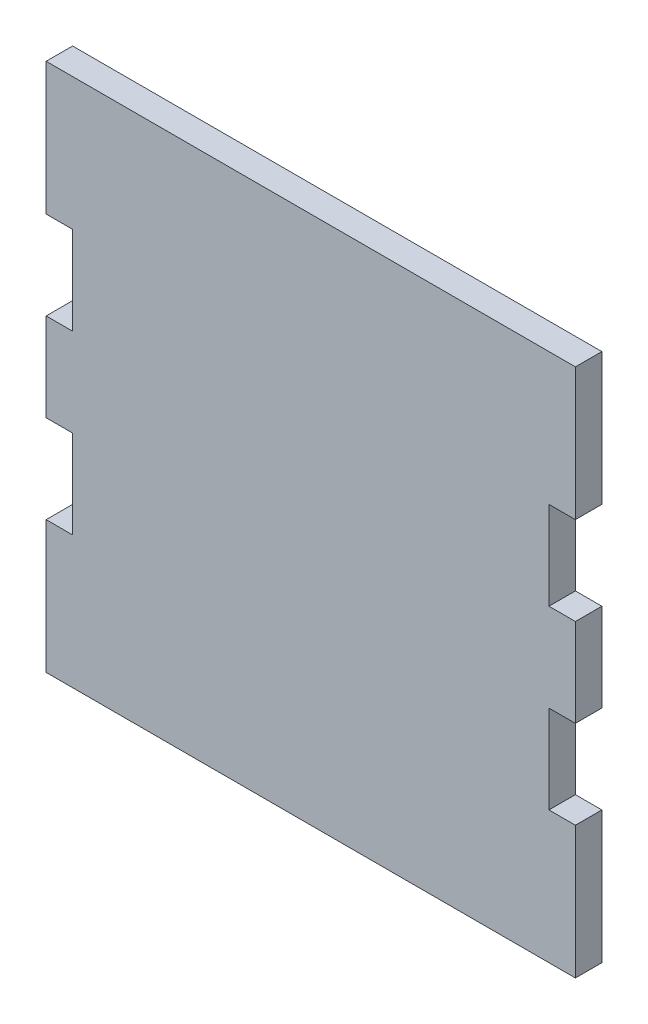
ISO-10303-21;
HEADER;
FILE_DESCRIPTION(('STEP AP214'),'2;1');
FILE_NAME('part.step','',(''),(''),'','','');
FILE_SCHEMA(('AUTOMOTIVE_DESIGN { 1 0 10303 214 1 1 1 1 }'));
ENDSEC;
DATA;
#1=APPLICATION_CONTEXT('core data for automotive mechanical design processes');
#2=APPLICATION_PROTOCOL_DEFINITION('international standard','automotive_design',2000,#1);
#3=PRODUCT_CONTEXT('',#1,'mechanical');
#4=PRODUCT('Part','Part','',(#3));
#5=PRODUCT_RELATED_PRODUCT_CATEGORY('part','',(#4));
#6=PRODUCT_DEFINITION_FORMATION('','',#4);
#7=PRODUCT_DEFINITION_CONTEXT('part definition',#1,'design');
#8=PRODUCT_DEFINITION('design','',#6,#7);
#9=PRODUCT_DEFINITION_SHAPE('','',#8);
#10=(LENGTH_UNIT() NAMED_UNIT(*) SI_UNIT(.MILLI.,.METRE.));
#11=(NAMED_UNIT(*) PLANE_ANGLE_UNIT() SI_UNIT($,.RADIAN.));
#12=(NAMED_UNIT(*) SI_UNIT($,.STERADIAN.) SOLID_ANGLE_UNIT());
#13=UNCERTAINTY_MEASURE_WITH_UNIT(LENGTH_MEASURE(1.E-05),#10,'distance_accuracy_value','');
#14=(GEOMETRIC_REPRESENTATION_CONTEXT(3) GLOBAL_UNCERTAINTY_ASSIGNED_CONTEXT((#13)) GLOBAL_UNIT_ASSIGNED_CONTEXT((#10,
#11,#12)) REPRESENTATION_CONTEXT('',''));
#15=CARTESIAN_POINT('',(0.,0.,0.));
#16=DIRECTION('',(0.,0.,1.));
#17=DIRECTION('',(1.,0.,0.));
#18=AXIS2_PLACEMENT_3D('',#15,#16,#17);
#19=CARTESIAN_POINT('',(-30.,0.,3.));
#20=DIRECTION('',(-1.,0.,0.));
#21=DIRECTION('',(0.,0.,1.));
#22=AXIS2_PLACEMENT_3D('',#19,#20,#21);
#23=PLANE('',#22);
#24=DIRECTION('',(0.,1.,0.));
#25=VECTOR('',#24,1.);
#26=CARTESIAN_POINT('',(-30.,0.,0.));
#27=LINE('',#26,#25);
#28=CARTESIAN_POINT('',(-30.,15.,0.));
#29=VERTEX_POINT('',#28);
#30=CARTESIAN_POINT('',(-30.,30.,0.));
#31=VERTEX_POINT('',#30);
#32=EDGE_CURVE('E201',#29,#31,#27,.T.);
#33=ORIENTED_EDGE('',*,*,#32,.F.);
#34=DIRECTION('',(0.,0.,-1.));
#35=VECTOR('',#34,1.);
#36=CARTESIAN_POINT('',(-30.,15.,3.));
#37=LINE('',#36,#35);
#38=CARTESIAN_POINT('',(-30.,15.,3.));
#39=VERTEX_POINT('',#38);
#40=EDGE_CURVE('E11',#39,#29,#37,.T.);
#41=ORIENTED_EDGE('',*,*,#40,.F.);
#42=DIRECTION('',(0.,1.,0.));
#43=VECTOR('',#42,1.);
#44=CARTESIAN_POINT('',(-30.,0.,3.));
#45=LINE('',#44,#43);
#46=CARTESIAN_POINT('',(-30.,30.,3.));
#47=VERTEX_POINT('',#46);
#48=EDGE_CURVE('E247',#39,#47,#45,.T.);
#49=ORIENTED_EDGE('',*,*,#48,.T.);
#50=DIRECTION('',(0.,0.,-1.));
#51=VECTOR('',#50,1.);
#52=CARTESIAN_POINT('',(-30.,30.,3.));
#53=LINE('',#52,#51);
#54=EDGE_CURVE('E52',#47,#31,#53,.T.);
#55=ORIENTED_EDGE('',*,*,#54,.T.);
#56=EDGE_LOOP('',(#33,#41,#49,#55));
#57=FACE_BOUND('',#56,.T.);
#58=ADVANCED_FACE('F35',(#57),#23,.T.);
#59=CARTESIAN_POINT('',(0.,15.,3.));
#60=DIRECTION('',(0.,1.,0.));
#61=DIRECTION('',(0.,0.,1.));
#62=AXIS2_PLACEMENT_3D('',#59,#60,#61);
#63=PLANE('',#62);
#64=DIRECTION('',(1.,0.,0.));
#65=VECTOR('',#64,1.);
#66=CARTESIAN_POINT('',(0.,15.,0.));
#67=LINE('',#66,#65);
#68=CARTESIAN_POINT('',(-27.,15.,0.));
#69=VERTEX_POINT('',#68);
#70=EDGE_CURVE('E203',#29,#69,#67,.T.);
#71=ORIENTED_EDGE('',*,*,#70,.T.);
#72=DIRECTION('',(0.,0.,-1.));
#73=VECTOR('',#72,1.);
#74=CARTESIAN_POINT('',(-27.,15.,3.));
#75=LINE('',#74,#73);
#76=CARTESIAN_POINT('',(-27.,15.,3.));
#77=VERTEX_POINT('',#76);
#78=EDGE_CURVE('E44',#77,#69,#75,.T.);
#79=ORIENTED_EDGE('',*,*,#78,.F.);
#80=DIRECTION('',(1.,0.,0.));
#81=VECTOR('',#80,1.);
#82=CARTESIAN_POINT('',(0.,15.,3.));
#83=LINE('',#82,#81);
#84=EDGE_CURVE('E310',#39,#77,#83,.T.);
#85=ORIENTED_EDGE('',*,*,#84,.F.);
#86=ORIENTED_EDGE('',*,*,#40,.T.);
#87=EDGE_LOOP('',(#71,#79,#85,#86));
#88=FACE_BOUND('',#87,.T.);
#89=ADVANCED_FACE('F37',(#88),#63,.F.);
#90=CARTESIAN_POINT('',(-27.,0.,3.));
#91=DIRECTION('',(1.,0.,0.));
#92=DIRECTION('',(0.,0.,-1.));
#93=AXIS2_PLACEMENT_3D('',#90,#91,#92);
#94=PLANE('',#93);
#95=DIRECTION('',(0.,-1.,0.));
#96=VECTOR('',#95,1.);
#97=CARTESIAN_POINT('',(-27.,0.,0.));
#98=LINE('',#97,#96);
#99=CARTESIAN_POINT('',(-27.,5.,0.));
#100=VERTEX_POINT('',#99);
#101=EDGE_CURVE('E207',#69,#100,#98,.T.);
#102=ORIENTED_EDGE('',*,*,#101,.T.);
#103=DIRECTION('',(0.,0.,-1.));
#104=VECTOR('',#103,1.);
#105=CARTESIAN_POINT('',(-27.,5.,3.));
#106=LINE('',#105,#104);
#107=CARTESIAN_POINT('',(-27.,5.,3.));
#108=VERTEX_POINT('',#107);
#109=EDGE_CURVE('E281',#108,#100,#106,.T.);
#110=ORIENTED_EDGE('',*,*,#109,.F.);
#111=DIRECTION('',(0.,-1.,0.));
#112=VECTOR('',#111,1.);
#113=CARTESIAN_POINT('',(-27.,0.,3.));
#114=LINE('',#113,#112);
#115=EDGE_CURVE('E289',#77,#108,#114,.T.);
#116=ORIENTED_EDGE('',*,*,#115,.F.);
#117=ORIENTED_EDGE('',*,*,#78,.T.);
#118=EDGE_LOOP('',(#102,#110,#116,#117));
#119=FACE_BOUND('',#118,.T.);
#120=ADVANCED_FACE('F287',(#119),#94,.F.);
#121=CARTESIAN_POINT('',(0.,5.,3.));
#122=DIRECTION('',(0.,1.,0.));
#123=DIRECTION('',(0.,0.,1.));
#124=AXIS2_PLACEMENT_3D('',#121,#122,#123);
#125=PLANE('',#124);
#126=DIRECTION('',(1.,0.,0.));
#127=VECTOR('',#126,1.);
#128=CARTESIAN_POINT('',(0.,5.,0.));
#129=LINE('',#128,#127);
#130=CARTESIAN_POINT('',(-30.,5.,0.));
#131=VERTEX_POINT('',#130);
#132=EDGE_CURVE('E210',#131,#100,#129,.T.);
#133=ORIENTED_EDGE('',*,*,#132,.F.);
#134=DIRECTION('',(0.,0.,-1.));
#135=VECTOR('',#134,1.);
#136=CARTESIAN_POINT('',(-30.,5.,3.));
#137=LINE('',#136,#135);
#138=CARTESIAN_POINT('',(-30.,5.,3.));
#139=VERTEX_POINT('',#138);
#140=EDGE_CURVE('E279',#139,#131,#137,.T.);
#141=ORIENTED_EDGE('',*,*,#140,.F.);
#142=DIRECTION('',(1.,0.,0.));
#143=VECTOR('',#142,1.);
#144=CARTESIAN_POINT('',(0.,5.,3.));
#145=LINE('',#144,#143);
#146=EDGE_CURVE('E302',#139,#108,#145,.T.);
#147=ORIENTED_EDGE('',*,*,#146,.T.);
#148=ORIENTED_EDGE('',*,*,#109,.T.);
#149=EDGE_LOOP('',(#133,#141,#147,#148));
#150=FACE_BOUND('',#149,.T.);
#151=ADVANCED_FACE('F299',(#150),#125,.T.);
#152=CARTESIAN_POINT('',(-30.,-5.,0.));
#153=VERTEX_POINT('',#152);
#154=EDGE_CURVE('E205',#153,#131,#27,.T.);
#155=ORIENTED_EDGE('',*,*,#154,.F.);
#156=DIRECTION('',(0.,0.,-1.));
#157=VECTOR('',#156,1.);
#158=CARTESIAN_POINT('',(-30.,-5.,3.));
#159=LINE('',#158,#157);
#160=CARTESIAN_POINT('',(-30.,-5.,3.));
#161=VERTEX_POINT('',#160);
#162=EDGE_CURVE('E277',#161,#153,#159,.T.);
#163=ORIENTED_EDGE('',*,*,#162,.F.);
#164=EDGE_CURVE('E305',#161,#139,#45,.T.);
#165=ORIENTED_EDGE('',*,*,#164,.T.);
#166=ORIENTED_EDGE('',*,*,#140,.T.);
#167=EDGE_LOOP('',(#155,#163,#165,#166));
#168=FACE_BOUND('',#167,.T.);
#169=ADVANCED_FACE('F351',(#168),#23,.T.);
#170=CARTESIAN_POINT('',(0.,-5.,3.));
#171=DIRECTION('',(0.,1.,0.));
#172=DIRECTION('',(0.,0.,1.));
#173=AXIS2_PLACEMENT_3D('',#170,#171,#172);
#174=PLANE('',#173);
#175=DIRECTION('',(1.,0.,0.));
#176=VECTOR('',#175,1.);
#177=CARTESIAN_POINT('',(0.,-5.,0.));
#178=LINE('',#177,#176);
#179=CARTESIAN_POINT('',(-27.,-5.,0.));
#180=VERTEX_POINT('',#179);
#181=EDGE_CURVE('E213',#153,#180,#178,.T.);
#182=ORIENTED_EDGE('',*,*,#181,.T.);
#183=DIRECTION('',(0.,0.,-1.));
#184=VECTOR('',#183,1.);
#185=CARTESIAN_POINT('',(-27.,-5.,3.));
#186=LINE('',#185,#184);
#187=CARTESIAN_POINT('',(-27.,-5.,3.));
#188=VERTEX_POINT('',#187);
#189=EDGE_CURVE('E274',#188,#180,#186,.T.);
#190=ORIENTED_EDGE('',*,*,#189,.F.);
#191=DIRECTION('',(1.,0.,0.));
#192=VECTOR('',#191,1.);
#193=CARTESIAN_POINT('',(0.,-5.,3.));
#194=LINE('',#193,#192);
#195=EDGE_CURVE('E307',#161,#188,#194,.T.);
#196=ORIENTED_EDGE('',*,*,#195,.F.);
#197=ORIENTED_EDGE('',*,*,#162,.T.);
#198=EDGE_LOOP('',(#182,#190,#196,#197));
#199=FACE_BOUND('',#198,.T.);
#200=ADVANCED_FACE('F359',(#199),#174,.F.);
#201=CARTESIAN_POINT('',(-27.,0.,3.));
#202=DIRECTION('',(1.,0.,0.));
#203=DIRECTION('',(0.,0.,-1.));
#204=AXIS2_PLACEMENT_3D('',#201,#202,#203);
#205=PLANE('',#204);
#206=DIRECTION('',(0.,-1.,0.));
#207=VECTOR('',#206,1.);
#208=CARTESIAN_POINT('',(-27.,0.,0.));
#209=LINE('',#208,#207);
#210=CARTESIAN_POINT('',(-27.,-15.,0.));
#211=VERTEX_POINT('',#210);
#212=EDGE_CURVE('E215',#180,#211,#209,.T.);
#213=ORIENTED_EDGE('',*,*,#212,.T.);
#214=DIRECTION('',(0.,0.,-1.));
#215=VECTOR('',#214,1.);
#216=CARTESIAN_POINT('',(-27.,-15.,3.));
#217=LINE('',#216,#215);
#218=CARTESIAN_POINT('',(-27.,-15.,3.));
#219=VERTEX_POINT('',#218);
#220=EDGE_CURVE('E272',#219,#211,#217,.T.);
#221=ORIENTED_EDGE('',*,*,#220,.F.);
#222=DIRECTION('',(0.,-1.,0.));
#223=VECTOR('',#222,1.);
#224=CARTESIAN_POINT('',(-27.,0.,3.));
#225=LINE('',#224,#223);
#226=EDGE_CURVE('E315',#188,#219,#225,.T.);
#227=ORIENTED_EDGE('',*,*,#226,.F.);
#228=ORIENTED_EDGE('',*,*,#189,.T.);
#229=EDGE_LOOP('',(#213,#221,#227,#228));
#230=FACE_BOUND('',#229,.T.);
#231=ADVANCED_FACE('F371',(#230),#205,.F.);
#232=CARTESIAN_POINT('',(0.,-15.,3.));
#233=DIRECTION('',(0.,1.,0.));
#234=DIRECTION('',(0.,0.,1.));
#235=AXIS2_PLACEMENT_3D('',#232,#233,#234);
#236=PLANE('',#235);
#237=DIRECTION('',(1.,0.,0.));
#238=VECTOR('',#237,1.);
#239=CARTESIAN_POINT('',(0.,-15.,0.));
#240=LINE('',#239,#238);
#241=CARTESIAN_POINT('',(-30.,-15.,0.));
#242=VERTEX_POINT('',#241);
#243=EDGE_CURVE('E218',#242,#211,#240,.T.);
#244=ORIENTED_EDGE('',*,*,#243,.F.);
#245=DIRECTION('',(0.,0.,-1.));
#246=VECTOR('',#245,1.);
#247=CARTESIAN_POINT('',(-30.,-15.,3.));
#248=LINE('',#247,#246);
#249=CARTESIAN_POINT('',(-30.,-15.,3.));
#250=VERTEX_POINT('',#249);
#251=EDGE_CURVE('E270',#250,#242,#248,.T.);
#252=ORIENTED_EDGE('',*,*,#251,.F.);
#253=DIRECTION('',(1.,0.,0.));
#254=VECTOR('',#253,1.);
#255=CARTESIAN_POINT('',(0.,-15.,3.));
#256=LINE('',#255,#254);
#257=EDGE_CURVE('E317',#250,#219,#256,.T.);
#258=ORIENTED_EDGE('',*,*,#257,.T.);
#259=ORIENTED_EDGE('',*,*,#220,.T.);
#260=EDGE_LOOP('',(#244,#252,#258,#259));
#261=FACE_BOUND('',#260,.T.);
#262=ADVANCED_FACE('F363',(#261),#236,.T.);
#263=CARTESIAN_POINT('',(-30.,-30.,0.));
#264=VERTEX_POINT('',#263);
#265=EDGE_CURVE('E204',#264,#242,#27,.T.);
#266=ORIENTED_EDGE('',*,*,#265,.F.);
#267=DIRECTION('',(0.,0.,-1.));
#268=VECTOR('',#267,1.);
#269=CARTESIAN_POINT('',(-30.,-30.,3.));
#270=LINE('',#269,#268);
#271=CARTESIAN_POINT('',(-30.,-30.,3.));
#272=VERTEX_POINT('',#271);
#273=EDGE_CURVE('E268',#272,#264,#270,.T.);
#274=ORIENTED_EDGE('',*,*,#273,.F.);
#275=EDGE_CURVE('E309',#272,#250,#45,.T.);
#276=ORIENTED_EDGE('',*,*,#275,.T.);
#277=ORIENTED_EDGE('',*,*,#251,.T.);
#278=EDGE_LOOP('',(#266,#274,#276,#277));
#279=FACE_BOUND('',#278,.T.);
#280=ADVANCED_FACE('F352',(#279),#23,.T.);
#281=CARTESIAN_POINT('',(0.,-30.,3.));
#282=DIRECTION('',(0.,1.,0.));
#283=DIRECTION('',(0.,0.,1.));
#284=AXIS2_PLACEMENT_3D('',#281,#282,#283);
#285=PLANE('',#284);
#286=DIRECTION('',(1.,0.,0.));
#287=VECTOR('',#286,1.);
#288=CARTESIAN_POINT('',(0.,-30.,0.));
#289=LINE('',#288,#287);
#290=CARTESIAN_POINT('',(30.,-30.,0.));
#291=VERTEX_POINT('',#290);
#292=EDGE_CURVE('E221',#264,#291,#289,.T.);
#293=ORIENTED_EDGE('',*,*,#292,.T.);
#294=DIRECTION('',(0.,0.,-1.));
#295=VECTOR('',#294,1.);
#296=CARTESIAN_POINT('',(30.,-30.,3.));
#297=LINE('',#296,#295);
#298=CARTESIAN_POINT('',(30.,-30.,3.));
#299=VERTEX_POINT('',#298);
#300=EDGE_CURVE('E265',#299,#291,#297,.T.);
#301=ORIENTED_EDGE('',*,*,#300,.F.);
#302=DIRECTION('',(1.,0.,0.));
#303=VECTOR('',#302,1.);
#304=CARTESIAN_POINT('',(0.,-30.,3.));
#305=LINE('',#304,#303);
#306=EDGE_CURVE('E320',#272,#299,#305,.T.);
#307=ORIENTED_EDGE('',*,*,#306,.F.);
#308=ORIENTED_EDGE('',*,*,#273,.T.);
#309=EDGE_LOOP('',(#293,#301,#307,#308));
#310=FACE_BOUND('',#309,.T.);
#311=ADVANCED_FACE('F362',(#310),#285,.F.);
#312=CARTESIAN_POINT('',(30.,0.,3.));
#313=DIRECTION('',(-1.,0.,0.));
#314=DIRECTION('',(0.,0.,1.));
#315=AXIS2_PLACEMENT_3D('',#312,#313,#314);
#316=PLANE('',#315);
#317=DIRECTION('',(0.,1.,0.));
#318=VECTOR('',#317,1.);
#319=CARTESIAN_POINT('',(30.,0.,0.));
#320=LINE('',#319,#318);
#321=CARTESIAN_POINT('',(30.,-15.,0.));
#322=VERTEX_POINT('',#321);
#323=EDGE_CURVE('E223',#291,#322,#320,.T.);
#324=ORIENTED_EDGE('',*,*,#323,.T.);
#325=DIRECTION('',(0.,0.,-1.));
#326=VECTOR('',#325,1.);
#327=CARTESIAN_POINT('',(30.,-15.,3.));
#328=LINE('',#327,#326);
#329=CARTESIAN_POINT('',(30.,-15.,3.));
#330=VERTEX_POINT('',#329);
#331=EDGE_CURVE('E262',#330,#322,#328,.T.);
#332=ORIENTED_EDGE('',*,*,#331,.F.);
#333=DIRECTION('',(0.,1.,0.));
#334=VECTOR('',#333,1.);
#335=CARTESIAN_POINT('',(30.,0.,3.));
#336=LINE('',#335,#334);
#337=EDGE_CURVE('E322',#299,#330,#336,.T.);
#338=ORIENTED_EDGE('',*,*,#337,.F.);
#339=ORIENTED_EDGE('',*,*,#300,.T.);
#340=EDGE_LOOP('',(#324,#332,#338,#339));
#341=FACE_BOUND('',#340,.T.);
#342=ADVANCED_FACE('F369',(#341),#316,.F.);
#343=CARTESIAN_POINT('',(0.,-15.,3.));
#344=DIRECTION('',(0.,-1.,0.));
#345=DIRECTION('',(0.,0.,-1.));
#346=AXIS2_PLACEMENT_3D('',#343,#344,#345);
#347=PLANE('',#346);
#348=DIRECTION('',(-1.,0.,0.));
#349=VECTOR('',#348,1.);
#350=CARTESIAN_POINT('',(0.,-15.,0.));
#351=LINE('',#350,#349);
#352=CARTESIAN_POINT('',(27.,-15.,0.));
#353=VERTEX_POINT('',#352);
#354=EDGE_CURVE('E225',#322,#353,#351,.T.);
#355=ORIENTED_EDGE('',*,*,#354,.T.);
#356=DIRECTION('',(0.,0.,-1.));
#357=VECTOR('',#356,1.);
#358=CARTESIAN_POINT('',(27.,-15.,3.));
#359=LINE('',#358,#357);
#360=CARTESIAN_POINT('',(27.,-15.,3.));
#361=VERTEX_POINT('',#360);
#362=EDGE_CURVE('E260',#361,#353,#359,.T.);
#363=ORIENTED_EDGE('',*,*,#362,.F.);
#364=DIRECTION('',(-1.,0.,0.));
#365=VECTOR('',#364,1.);
#366=CARTESIAN_POINT('',(0.,-15.,3.));
#367=LINE('',#366,#365);
#368=EDGE_CURVE('E324',#330,#361,#367,.T.);
#369=ORIENTED_EDGE('',*,*,#368,.F.);
#370=ORIENTED_EDGE('',*,*,#331,.T.);
#371=EDGE_LOOP('',(#355,#363,#369,#370));
#372=FACE_BOUND('',#371,.T.);
#373=ADVANCED_FACE('F455',(#372),#347,.F.);
#374=CARTESIAN_POINT('',(27.,0.,3.));
#375=DIRECTION('',(1.,0.,0.));
#376=DIRECTION('',(0.,0.,-1.));
#377=AXIS2_PLACEMENT_3D('',#374,#375,#376);
#378=PLANE('',#377);
#379=DIRECTION('',(0.,-1.,0.));
#380=VECTOR('',#379,1.);
#381=CARTESIAN_POINT('',(27.,0.,0.));
#382=LINE('',#381,#380);
#383=CARTESIAN_POINT('',(27.,-5.,0.));
#384=VERTEX_POINT('',#383);
#385=EDGE_CURVE('E229',#384,#353,#382,.T.);
#386=ORIENTED_EDGE('',*,*,#385,.F.);
#387=DIRECTION('',(0.,0.,-1.));
#388=VECTOR('',#387,1.);
#389=CARTESIAN_POINT('',(27.,-5.,3.));
#390=LINE('',#389,#388);
#391=CARTESIAN_POINT('',(27.,-5.,3.));
#392=VERTEX_POINT('',#391);
#393=EDGE_CURVE('E258',#392,#384,#390,.T.);
#394=ORIENTED_EDGE('',*,*,#393,.F.);
#395=DIRECTION('',(0.,-1.,0.));
#396=VECTOR('',#395,1.);
#397=CARTESIAN_POINT('',(27.,0.,3.));
#398=LINE('',#397,#396);
#399=EDGE_CURVE('E327',#392,#361,#398,.T.);
#400=ORIENTED_EDGE('',*,*,#399,.T.);
#401=ORIENTED_EDGE('',*,*,#362,.T.);
#402=EDGE_LOOP('',(#386,#394,#400,#401));
#403=FACE_BOUND('',#402,.T.);
#404=ADVANCED_FACE('F465',(#403),#378,.T.);
#405=CARTESIAN_POINT('',(0.,-5.,3.));
#406=DIRECTION('',(0.,-1.,0.));
#407=DIRECTION('',(0.,0.,-1.));
#408=AXIS2_PLACEMENT_3D('',#405,#406,#407);
#409=PLANE('',#408);
#410=DIRECTION('',(-1.,0.,0.));
#411=VECTOR('',#410,1.);
#412=CARTESIAN_POINT('',(0.,-5.,0.));
#413=LINE('',#412,#411);
#414=CARTESIAN_POINT('',(30.,-5.,0.));
#415=VERTEX_POINT('',#414);
#416=EDGE_CURVE('E232',#415,#384,#413,.T.);
#417=ORIENTED_EDGE('',*,*,#416,.F.);
#418=DIRECTION('',(0.,0.,-1.));
#419=VECTOR('',#418,1.);
#420=CARTESIAN_POINT('',(30.,-5.,3.));
#421=LINE('',#420,#419);
#422=CARTESIAN_POINT('',(30.,-5.,3.));
#423=VERTEX_POINT('',#422);
#424=EDGE_CURVE('E256',#423,#415,#421,.T.);
#425=ORIENTED_EDGE('',*,*,#424,.F.);
#426=DIRECTION('',(-1.,0.,0.));
#427=VECTOR('',#426,1.);
#428=CARTESIAN_POINT('',(0.,-5.,3.));
#429=LINE('',#428,#427);
#430=EDGE_CURVE('E330',#423,#392,#429,.T.);
#431=ORIENTED_EDGE('',*,*,#430,.T.);
#432=ORIENTED_EDGE('',*,*,#393,.T.);
#433=EDGE_LOOP('',(#417,#425,#431,#432));
#434=FACE_BOUND('',#433,.T.);
#435=ADVANCED_FACE('F475',(#434),#409,.T.);
#436=CARTESIAN_POINT('',(30.,5.,0.));
#437=VERTEX_POINT('',#436);
#438=EDGE_CURVE('E226',#415,#437,#320,.T.);
#439=ORIENTED_EDGE('',*,*,#438,.T.);
#440=DIRECTION('',(0.,0.,-1.));
#441=VECTOR('',#440,1.);
#442=CARTESIAN_POINT('',(30.,5.,3.));
#443=LINE('',#442,#441);
#444=CARTESIAN_POINT('',(30.,5.,3.));
#445=VERTEX_POINT('',#444);
#446=EDGE_CURVE('E253',#445,#437,#443,.T.);
#447=ORIENTED_EDGE('',*,*,#446,.F.);
#448=EDGE_CURVE('E325',#423,#445,#336,.T.);
#449=ORIENTED_EDGE('',*,*,#448,.F.);
#450=ORIENTED_EDGE('',*,*,#424,.T.);
#451=EDGE_LOOP('',(#439,#447,#449,#450));
#452=FACE_BOUND('',#451,.T.);
#453=ADVANCED_FACE('F457',(#452),#316,.F.);
#454=CARTESIAN_POINT('',(0.,5.,3.));
#455=DIRECTION('',(0.,-1.,0.));
#456=DIRECTION('',(0.,0.,-1.));
#457=AXIS2_PLACEMENT_3D('',#454,#455,#456);
#458=PLANE('',#457);
#459=DIRECTION('',(-1.,0.,0.));
#460=VECTOR('',#459,1.);
#461=CARTESIAN_POINT('',(0.,5.,0.));
#462=LINE('',#461,#460);
#463=CARTESIAN_POINT('',(27.,5.,0.));
#464=VERTEX_POINT('',#463);
#465=EDGE_CURVE('E235',#437,#464,#462,.T.);
#466=ORIENTED_EDGE('',*,*,#465,.T.);
#467=DIRECTION('',(0.,0.,-1.));
#468=VECTOR('',#467,1.);
#469=CARTESIAN_POINT('',(27.,5.,3.));
#470=LINE('',#469,#468);
#471=CARTESIAN_POINT('',(27.,5.,3.));
#472=VERTEX_POINT('',#471);
#473=EDGE_CURVE('E251',#472,#464,#470,.T.);
#474=ORIENTED_EDGE('',*,*,#473,.F.);
#475=DIRECTION('',(-1.,0.,0.));
#476=VECTOR('',#475,1.);
#477=CARTESIAN_POINT('',(0.,5.,3.));
#478=LINE('',#477,#476);
#479=EDGE_CURVE('E333',#445,#472,#478,.T.);
#480=ORIENTED_EDGE('',*,*,#479,.F.);
#481=ORIENTED_EDGE('',*,*,#446,.T.);
#482=EDGE_LOOP('',(#466,#474,#480,#481));
#483=FACE_BOUND('',#482,.T.);
#484=ADVANCED_FACE('F495',(#483),#458,.F.);
#485=CARTESIAN_POINT('',(27.,0.,3.));
#486=DIRECTION('',(1.,0.,0.));
#487=DIRECTION('',(0.,0.,-1.));
#488=AXIS2_PLACEMENT_3D('',#485,#486,#487);
#489=PLANE('',#488);
#490=DIRECTION('',(0.,-1.,0.));
#491=VECTOR('',#490,1.);
#492=CARTESIAN_POINT('',(27.,0.,0.));
#493=LINE('',#492,#491);
#494=CARTESIAN_POINT('',(27.,15.,0.));
#495=VERTEX_POINT('',#494);
#496=EDGE_CURVE('E238',#495,#464,#493,.T.);
#497=ORIENTED_EDGE('',*,*,#496,.F.);
#498=DIRECTION('',(0.,0.,-1.));
#499=VECTOR('',#498,1.);
#500=CARTESIAN_POINT('',(27.,15.,3.));
#501=LINE('',#500,#499);
#502=CARTESIAN_POINT('',(27.,15.,3.));
#503=VERTEX_POINT('',#502);
#504=EDGE_CURVE('E183',#503,#495,#501,.T.);
#505=ORIENTED_EDGE('',*,*,#504,.F.);
#506=DIRECTION('',(0.,-1.,0.));
#507=VECTOR('',#506,1.);
#508=CARTESIAN_POINT('',(27.,0.,3.));
#509=LINE('',#508,#507);
#510=EDGE_CURVE('E193',#503,#472,#509,.T.);
#511=ORIENTED_EDGE('',*,*,#510,.T.);
#512=ORIENTED_EDGE('',*,*,#473,.T.);
#513=EDGE_LOOP('',(#497,#505,#511,#512));
#514=FACE_BOUND('',#513,.T.);
#515=ADVANCED_FACE('F336',(#514),#489,.T.);
#516=CARTESIAN_POINT('',(0.,15.,3.));
#517=DIRECTION('',(0.,-1.,0.));
#518=DIRECTION('',(0.,0.,-1.));
#519=AXIS2_PLACEMENT_3D('',#516,#517,#518);
#520=PLANE('',#519);
#521=DIRECTION('',(-1.,0.,0.));
#522=VECTOR('',#521,1.);
#523=CARTESIAN_POINT('',(0.,15.,0.));
#524=LINE('',#523,#522);
#525=CARTESIAN_POINT('',(30.,15.,0.));
#526=VERTEX_POINT('',#525);
#527=EDGE_CURVE('E179',#526,#495,#524,.T.);
#528=ORIENTED_EDGE('',*,*,#527,.F.);
#529=DIRECTION('',(0.,0.,-1.));
#530=VECTOR('',#529,1.);
#531=CARTESIAN_POINT('',(30.,15.,3.));
#532=LINE('',#531,#530);
#533=CARTESIAN_POINT('',(30.,15.,3.));
#534=VERTEX_POINT('',#533);
#535=EDGE_CURVE('E174',#534,#526,#532,.T.);
#536=ORIENTED_EDGE('',*,*,#535,.F.);
#537=DIRECTION('',(-1.,0.,0.));
#538=VECTOR('',#537,1.);
#539=CARTESIAN_POINT('',(0.,15.,3.));
#540=LINE('',#539,#538);
#541=EDGE_CURVE('E177',#534,#503,#540,.T.);
#542=ORIENTED_EDGE('',*,*,#541,.T.);
#543=ORIENTED_EDGE('',*,*,#504,.T.);
#544=EDGE_LOOP('',(#528,#536,#542,#543));
#545=FACE_BOUND('',#544,.T.);
#546=ADVANCED_FACE('F176',(#545),#520,.T.);
#547=CARTESIAN_POINT('',(30.,0.,3.));
#548=DIRECTION('',(1.,0.,0.));
#549=DIRECTION('',(0.,0.,-1.));
#550=AXIS2_PLACEMENT_3D('',#547,#548,#549);
#551=PLANE('',#550);
#552=DIRECTION('',(0.,-1.,0.));
#553=VECTOR('',#552,1.);
#554=CARTESIAN_POINT('',(30.,0.,0.));
#555=LINE('',#554,#553);
#556=CARTESIAN_POINT('',(30.,30.,0.));
#557=VERTEX_POINT('',#556);
#558=EDGE_CURVE('E242',#557,#526,#555,.T.);
#559=ORIENTED_EDGE('',*,*,#558,.F.);
#560=DIRECTION('',(0.,0.,-1.));
#561=VECTOR('',#560,1.);
#562=CARTESIAN_POINT('',(30.,30.,3.));
#563=LINE('',#562,#561);
#564=CARTESIAN_POINT('',(30.,30.,3.));
#565=VERTEX_POINT('',#564);
#566=EDGE_CURVE('E113',#565,#557,#563,.T.);
#567=ORIENTED_EDGE('',*,*,#566,.F.);
#568=DIRECTION('',(0.,-1.,0.));
#569=VECTOR('',#568,1.);
#570=CARTESIAN_POINT('',(30.,0.,3.));
#571=LINE('',#570,#569);
#572=EDGE_CURVE('E191',#565,#534,#571,.T.);
#573=ORIENTED_EDGE('',*,*,#572,.T.);
#574=ORIENTED_EDGE('',*,*,#535,.T.);
#575=EDGE_LOOP('',(#559,#567,#573,#574));
#576=FACE_BOUND('',#575,.T.);
#577=ADVANCED_FACE('F195',(#576),#551,.T.);
#578=CARTESIAN_POINT('',(0.,30.,3.));
#579=DIRECTION('',(0.,1.,0.));
#580=DIRECTION('',(0.,0.,1.));
#581=AXIS2_PLACEMENT_3D('',#578,#579,#580);
#582=PLANE('',#581);
#583=DIRECTION('',(1.,0.,0.));
#584=VECTOR('',#583,1.);
#585=CARTESIAN_POINT('',(0.,30.,0.));
#586=LINE('',#585,#584);
#587=EDGE_CURVE('E244',#31,#557,#586,.T.);
#588=ORIENTED_EDGE('',*,*,#587,.F.);
#589=ORIENTED_EDGE('',*,*,#54,.F.);
#590=DIRECTION('',(1.,0.,0.));
#591=VECTOR('',#590,1.);
#592=CARTESIAN_POINT('',(0.,30.,3.));
#593=LINE('',#592,#591);
#594=EDGE_CURVE('E196',#47,#565,#593,.T.);
#595=ORIENTED_EDGE('',*,*,#594,.T.);
#596=ORIENTED_EDGE('',*,*,#566,.T.);
#597=EDGE_LOOP('',(#588,#589,#595,#596));
#598=FACE_BOUND('',#597,.T.);
#599=ADVANCED_FACE('F339',(#598),#582,.T.);
#600=CARTESIAN_POINT('',(0.,0.,3.));
#601=DIRECTION('',(0.,0.,1.));
#602=DIRECTION('',(1.,0.,0.));
#603=AXIS2_PLACEMENT_3D('',#600,#601,#602);
#604=PLANE('',#603);
#605=ORIENTED_EDGE('',*,*,#48,.F.);
#606=ORIENTED_EDGE('',*,*,#84,.T.);
#607=ORIENTED_EDGE('',*,*,#115,.T.);
#608=ORIENTED_EDGE('',*,*,#146,.F.);
#609=ORIENTED_EDGE('',*,*,#164,.F.);
#610=ORIENTED_EDGE('',*,*,#195,.T.);
#611=ORIENTED_EDGE('',*,*,#226,.T.);
#612=ORIENTED_EDGE('',*,*,#257,.F.);
#613=ORIENTED_EDGE('',*,*,#275,.F.);
#614=ORIENTED_EDGE('',*,*,#306,.T.);
#615=ORIENTED_EDGE('',*,*,#337,.T.);
#616=ORIENTED_EDGE('',*,*,#368,.T.);
#617=ORIENTED_EDGE('',*,*,#399,.F.);
#618=ORIENTED_EDGE('',*,*,#430,.F.);
#619=ORIENTED_EDGE('',*,*,#448,.T.);
#620=ORIENTED_EDGE('',*,*,#479,.T.);
#621=ORIENTED_EDGE('',*,*,#510,.F.);
#622=ORIENTED_EDGE('',*,*,#541,.F.);
#623=ORIENTED_EDGE('',*,*,#572,.F.);
#624=ORIENTED_EDGE('',*,*,#594,.F.);
#625=EDGE_LOOP('',(#605,#606,#607,#608,#609,#610,#611,#612,#613,#614,#615,#616,#617,#618,#619,
#620,#621,#622,#623,#624));
#626=FACE_BOUND('',#625,.T.);
#627=ADVANCED_FACE('F189',(#626),#604,.T.);
#628=CARTESIAN_POINT('',(0.,0.,0.));
#629=DIRECTION('',(0.,0.,1.));
#630=DIRECTION('',(1.,0.,0.));
#631=AXIS2_PLACEMENT_3D('',#628,#629,#630);
#632=PLANE('',#631);
#633=ORIENTED_EDGE('',*,*,#32,.T.);
#634=ORIENTED_EDGE('',*,*,#587,.T.);
#635=ORIENTED_EDGE('',*,*,#558,.T.);
#636=ORIENTED_EDGE('',*,*,#527,.T.);
#637=ORIENTED_EDGE('',*,*,#496,.T.);
#638=ORIENTED_EDGE('',*,*,#465,.F.);
#639=ORIENTED_EDGE('',*,*,#438,.F.);
#640=ORIENTED_EDGE('',*,*,#416,.T.);
#641=ORIENTED_EDGE('',*,*,#385,.T.);
#642=ORIENTED_EDGE('',*,*,#354,.F.);
#643=ORIENTED_EDGE('',*,*,#323,.F.);
#644=ORIENTED_EDGE('',*,*,#292,.F.);
#645=ORIENTED_EDGE('',*,*,#265,.T.);
#646=ORIENTED_EDGE('',*,*,#243,.T.);
#647=ORIENTED_EDGE('',*,*,#212,.F.);
#648=ORIENTED_EDGE('',*,*,#181,.F.);
#649=ORIENTED_EDGE('',*,*,#154,.T.);
#650=ORIENTED_EDGE('',*,*,#132,.T.);
#651=ORIENTED_EDGE('',*,*,#101,.F.);
#652=ORIENTED_EDGE('',*,*,#70,.F.);
#653=EDGE_LOOP('',(#633,#634,#635,#636,#637,#638,#639,#640,#641,#642,#643,#644,#645,#646,#647,
#648,#649,#650,#651,#652));
#654=FACE_BOUND('',#653,.T.);
#655=ADVANCED_FACE('F293',(#654),#632,.F.);
#656=CLOSED_SHELL('',(#58,#89,#120,#151,#169,#200,#231,#262,#280,#311,#342,#373,#404,#435,#453,
#484,#515,#546,#577,#599,#627,#655));
#657=MANIFOLD_SOLID_BREP('B2',#656);
#658=ADVANCED_BREP_SHAPE_REPRESENTATION('',(#18,#657),#14);
#659=SHAPE_DEFINITION_REPRESENTATION(#9,#658);
ENDSEC;
END-ISO-10303-21;
